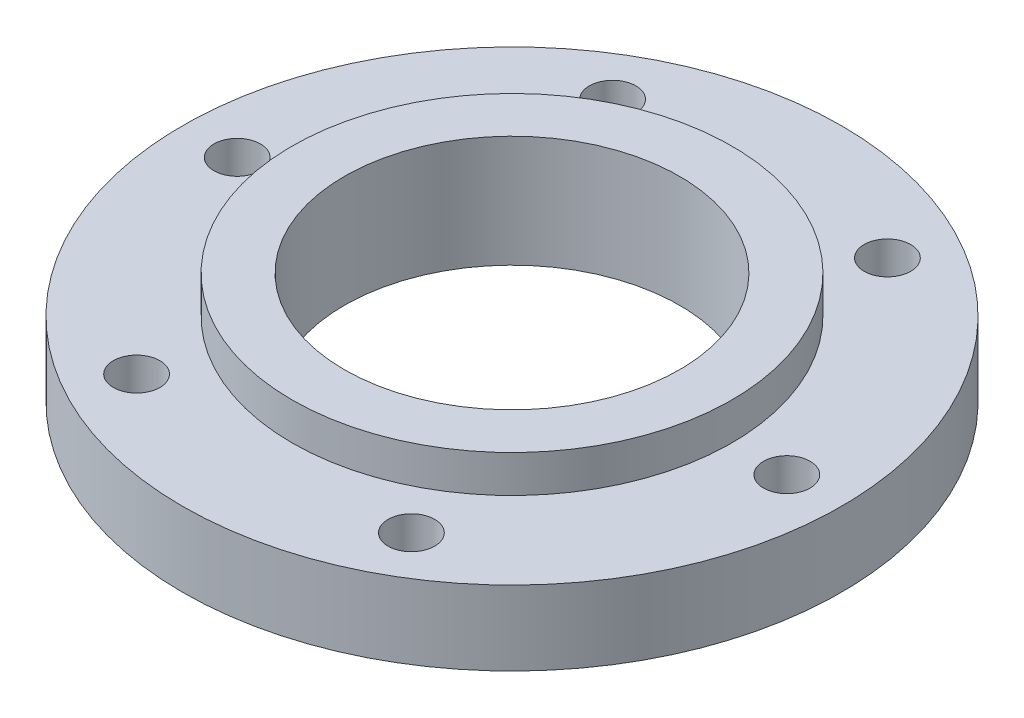
ISO-10303-21;
HEADER;
FILE_DESCRIPTION(('STEP AP214'),'2;1');
FILE_NAME('part.step','',(''),(''),'','','');
FILE_SCHEMA(('AUTOMOTIVE_DESIGN { 1 0 10303 214 1 1 1 1 }'));
ENDSEC;
DATA;
#1=APPLICATION_CONTEXT('core data for automotive mechanical design processes');
#2=APPLICATION_PROTOCOL_DEFINITION('international standard','automotive_design',2000,#1);
#3=PRODUCT_CONTEXT('',#1,'mechanical');
#4=PRODUCT('Part','Part','',(#3));
#5=PRODUCT_RELATED_PRODUCT_CATEGORY('part','',(#4));
#6=PRODUCT_DEFINITION_FORMATION('','',#4);
#7=PRODUCT_DEFINITION_CONTEXT('part definition',#1,'design');
#8=PRODUCT_DEFINITION('design','',#6,#7);
#9=PRODUCT_DEFINITION_SHAPE('','',#8);
#10=(LENGTH_UNIT() NAMED_UNIT(*) SI_UNIT(.MILLI.,.METRE.));
#11=(NAMED_UNIT(*) PLANE_ANGLE_UNIT() SI_UNIT($,.RADIAN.));
#12=(NAMED_UNIT(*) SI_UNIT($,.STERADIAN.) SOLID_ANGLE_UNIT());
#13=UNCERTAINTY_MEASURE_WITH_UNIT(LENGTH_MEASURE(1.E-05),#10,'distance_accuracy_value','');
#14=(GEOMETRIC_REPRESENTATION_CONTEXT(3) GLOBAL_UNCERTAINTY_ASSIGNED_CONTEXT((#13)) GLOBAL_UNIT_ASSIGNED_CONTEXT((#10,
#11,#12)) REPRESENTATION_CONTEXT('',''));
#15=CARTESIAN_POINT('',(0.,0.,0.));
#16=DIRECTION('',(0.,0.,1.));
#17=DIRECTION('',(1.,0.,0.));
#18=AXIS2_PLACEMENT_3D('',#15,#16,#17);
#19=CARTESIAN_POINT('',(0.,5.08,0.));
#20=DIRECTION('',(0.,1.,0.));
#21=DIRECTION('',(0.,0.,1.));
#22=AXIS2_PLACEMENT_3D('',#19,#20,#21);
#23=PLANE('',#22);
#24=CARTESIAN_POINT('',(-18.7454233572628,5.08,0.));
#25=DIRECTION('',(0.,1.,0.));
#26=DIRECTION('',(0.,0.,1.));
#27=AXIS2_PLACEMENT_3D('',#24,#25,#26);
#28=CIRCLE('',#27,1.5875);
#29=CARTESIAN_POINT('',(-18.7454233572628,5.08,1.5875));
#30=VERTEX_POINT('',#29);
#31=EDGE_CURVE('E83',#30,#30,#28,.T.);
#32=ORIENTED_EDGE('',*,*,#31,.F.);
#33=EDGE_LOOP('',(#32));
#34=FACE_BOUND('',#33,.T.);
#35=CARTESIAN_POINT('',(-9.3727116786316,5.08,16.2340128320837));
#36=DIRECTION('',(0.,1.,0.));
#37=DIRECTION('',(0.,0.,1.));
#38=AXIS2_PLACEMENT_3D('',#35,#36,#37);
#39=CIRCLE('',#38,1.5875);
#40=CARTESIAN_POINT('',(-9.3727116786316,5.08,17.8215128320837));
#41=VERTEX_POINT('',#40);
#42=EDGE_CURVE('E84',#41,#41,#39,.T.);
#43=ORIENTED_EDGE('',*,*,#42,.F.);
#44=EDGE_LOOP('',(#43));
#45=FACE_BOUND('',#44,.T.);
#46=CARTESIAN_POINT('',(9.37271167863126,5.08,16.2340128320839));
#47=DIRECTION('',(0.,1.,0.));
#48=DIRECTION('',(0.,0.,1.));
#49=AXIS2_PLACEMENT_3D('',#46,#47,#48);
#50=CIRCLE('',#49,1.5875);
#51=CARTESIAN_POINT('',(9.37271167863126,5.08,17.8215128320839));
#52=VERTEX_POINT('',#51);
#53=EDGE_CURVE('E58',#52,#52,#50,.T.);
#54=ORIENTED_EDGE('',*,*,#53,.F.);
#55=EDGE_LOOP('',(#54));
#56=FACE_BOUND('',#55,.T.);
#57=CARTESIAN_POINT('',(18.7454233572628,5.08,1.30898591681195E-13));
#58=DIRECTION('',(0.,1.,0.));
#59=DIRECTION('',(0.,0.,1.));
#60=AXIS2_PLACEMENT_3D('',#57,#58,#59);
#61=CIRCLE('',#60,1.5875);
#62=CARTESIAN_POINT('',(18.7454233572628,5.08,1.58750000000013));
#63=VERTEX_POINT('',#62);
#64=EDGE_CURVE('E65',#63,#63,#61,.T.);
#65=ORIENTED_EDGE('',*,*,#64,.F.);
#66=EDGE_LOOP('',(#65));
#67=FACE_BOUND('',#66,.T.);
#68=CARTESIAN_POINT('',(9.37271167863149,5.08,-16.2340128320837));
#69=DIRECTION('',(0.,1.,0.));
#70=DIRECTION('',(0.,0.,1.));
#71=AXIS2_PLACEMENT_3D('',#68,#69,#70);
#72=CIRCLE('',#71,1.5875);
#73=CARTESIAN_POINT('',(9.37271167863149,5.08,-14.6465128320837));
#74=VERTEX_POINT('',#73);
#75=EDGE_CURVE('E71',#74,#74,#72,.T.);
#76=ORIENTED_EDGE('',*,*,#75,.F.);
#77=EDGE_LOOP('',(#76));
#78=FACE_BOUND('',#77,.T.);
#79=CARTESIAN_POINT('',(-9.37271167863138,5.08,-16.2340128320838));
#80=DIRECTION('',(0.,1.,0.));
#81=DIRECTION('',(0.,0.,1.));
#82=AXIS2_PLACEMENT_3D('',#79,#80,#81);
#83=CIRCLE('',#82,1.5875);
#84=CARTESIAN_POINT('',(-9.37271167863138,5.08,-14.6465128320838));
#85=VERTEX_POINT('',#84);
#86=EDGE_CURVE('E77',#85,#85,#83,.T.);
#87=ORIENTED_EDGE('',*,*,#86,.F.);
#88=EDGE_LOOP('',(#87));
#89=FACE_BOUND('',#88,.T.);
#90=CARTESIAN_POINT('',(0.,5.08,0.));
#91=DIRECTION('',(0.,1.,0.));
#92=DIRECTION('',(0.,0.,1.));
#93=AXIS2_PLACEMENT_3D('',#90,#91,#92);
#94=CIRCLE('',#93,22.479);
#95=CARTESIAN_POINT('',(0.,5.08,22.479));
#96=VERTEX_POINT('',#95);
#97=EDGE_CURVE('E10',#96,#96,#94,.T.);
#98=ORIENTED_EDGE('',*,*,#97,.T.);
#99=EDGE_LOOP('',(#98));
#100=FACE_BOUND('',#99,.T.);
#101=CARTESIAN_POINT('',(0.,5.08,0.));
#102=DIRECTION('',(0.,1.,0.));
#103=DIRECTION('',(0.,0.,1.));
#104=AXIS2_PLACEMENT_3D('',#101,#102,#103);
#105=CIRCLE('',#104,14.9987);
#106=CARTESIAN_POINT('',(0.,5.08,14.9987));
#107=VERTEX_POINT('',#106);
#108=EDGE_CURVE('E49',#107,#107,#105,.T.);
#109=ORIENTED_EDGE('',*,*,#108,.F.);
#110=EDGE_LOOP('',(#109));
#111=FACE_BOUND('',#110,.T.);
#112=ADVANCED_FACE('F33',(#34,#45,#56,#67,#78,#89,#100,#111),#23,.T.);
#113=CARTESIAN_POINT('',(0.,0.,0.));
#114=DIRECTION('',(0.,1.,0.));
#115=DIRECTION('',(0.,0.,1.));
#116=AXIS2_PLACEMENT_3D('',#113,#114,#115);
#117=PLANE('',#116);
#118=CARTESIAN_POINT('',(-18.7454233572628,0.,0.));
#119=DIRECTION('',(0.,1.,0.));
#120=DIRECTION('',(0.,0.,1.));
#121=AXIS2_PLACEMENT_3D('',#118,#119,#120);
#122=CIRCLE('',#121,1.5875);
#123=CARTESIAN_POINT('',(-18.7454233572628,0.,1.5875));
#124=VERTEX_POINT('',#123);
#125=EDGE_CURVE('E57',#124,#124,#122,.T.);
#126=ORIENTED_EDGE('',*,*,#125,.T.);
#127=EDGE_LOOP('',(#126));
#128=FACE_BOUND('',#127,.T.);
#129=CARTESIAN_POINT('',(-9.3727116786316,0.,16.2340128320837));
#130=DIRECTION('',(0.,1.,0.));
#131=DIRECTION('',(0.,0.,1.));
#132=AXIS2_PLACEMENT_3D('',#129,#130,#131);
#133=CIRCLE('',#132,1.5875);
#134=CARTESIAN_POINT('',(-9.3727116786316,0.,17.8215128320837));
#135=VERTEX_POINT('',#134);
#136=EDGE_CURVE('E62',#135,#135,#133,.T.);
#137=ORIENTED_EDGE('',*,*,#136,.T.);
#138=EDGE_LOOP('',(#137));
#139=FACE_BOUND('',#138,.T.);
#140=CARTESIAN_POINT('',(9.37271167863126,0.,16.2340128320839));
#141=DIRECTION('',(0.,1.,0.));
#142=DIRECTION('',(0.,0.,1.));
#143=AXIS2_PLACEMENT_3D('',#140,#141,#142);
#144=CIRCLE('',#143,1.5875);
#145=CARTESIAN_POINT('',(9.37271167863126,0.,17.8215128320839));
#146=VERTEX_POINT('',#145);
#147=EDGE_CURVE('E61',#146,#146,#144,.T.);
#148=ORIENTED_EDGE('',*,*,#147,.T.);
#149=EDGE_LOOP('',(#148));
#150=FACE_BOUND('',#149,.T.);
#151=CARTESIAN_POINT('',(18.7454233572628,0.,1.30898591681195E-13));
#152=DIRECTION('',(0.,1.,0.));
#153=DIRECTION('',(0.,0.,1.));
#154=AXIS2_PLACEMENT_3D('',#151,#152,#153);
#155=CIRCLE('',#154,1.5875);
#156=CARTESIAN_POINT('',(18.7454233572628,0.,1.58750000000013));
#157=VERTEX_POINT('',#156);
#158=EDGE_CURVE('E68',#157,#157,#155,.T.);
#159=ORIENTED_EDGE('',*,*,#158,.T.);
#160=EDGE_LOOP('',(#159));
#161=FACE_BOUND('',#160,.T.);
#162=CARTESIAN_POINT('',(9.37271167863149,0.,-16.2340128320837));
#163=DIRECTION('',(0.,1.,0.));
#164=DIRECTION('',(0.,0.,1.));
#165=AXIS2_PLACEMENT_3D('',#162,#163,#164);
#166=CIRCLE('',#165,1.5875);
#167=CARTESIAN_POINT('',(9.37271167863149,0.,-14.6465128320837));
#168=VERTEX_POINT('',#167);
#169=EDGE_CURVE('E74',#168,#168,#166,.T.);
#170=ORIENTED_EDGE('',*,*,#169,.T.);
#171=EDGE_LOOP('',(#170));
#172=FACE_BOUND('',#171,.T.);
#173=CARTESIAN_POINT('',(-9.37271167863138,0.,-16.2340128320838));
#174=DIRECTION('',(0.,1.,0.));
#175=DIRECTION('',(0.,0.,1.));
#176=AXIS2_PLACEMENT_3D('',#173,#174,#175);
#177=CIRCLE('',#176,1.5875);
#178=CARTESIAN_POINT('',(-9.37271167863138,0.,-14.6465128320838));
#179=VERTEX_POINT('',#178);
#180=EDGE_CURVE('E80',#179,#179,#177,.T.);
#181=ORIENTED_EDGE('',*,*,#180,.T.);
#182=EDGE_LOOP('',(#181));
#183=FACE_BOUND('',#182,.T.);
#184=CARTESIAN_POINT('',(0.,0.,0.));
#185=DIRECTION('',(0.,1.,0.));
#186=DIRECTION('',(0.,0.,1.));
#187=AXIS2_PLACEMENT_3D('',#184,#185,#186);
#188=CIRCLE('',#187,22.479);
#189=CARTESIAN_POINT('',(0.,0.,22.479));
#190=VERTEX_POINT('',#189);
#191=EDGE_CURVE('E37',#190,#190,#188,.T.);
#192=ORIENTED_EDGE('',*,*,#191,.F.);
#193=EDGE_LOOP('',(#192));
#194=FACE_BOUND('',#193,.T.);
#195=CARTESIAN_POINT('',(0.,0.,0.));
#196=DIRECTION('',(0.,1.,0.));
#197=DIRECTION('',(0.,0.,1.));
#198=AXIS2_PLACEMENT_3D('',#195,#196,#197);
#199=CIRCLE('',#198,11.43);
#200=CARTESIAN_POINT('',(0.,0.,11.43));
#201=VERTEX_POINT('',#200);
#202=EDGE_CURVE('E44',#201,#201,#199,.T.);
#203=ORIENTED_EDGE('',*,*,#202,.T.);
#204=EDGE_LOOP('',(#203));
#205=FACE_BOUND('',#204,.T.);
#206=ADVANCED_FACE('F94',(#128,#139,#150,#161,#172,#183,#194,#205),#117,.F.);
#207=CARTESIAN_POINT('',(0.,5.08,0.));
#208=DIRECTION('',(0.,-1.,0.));
#209=DIRECTION('',(0.,0.,-1.));
#210=AXIS2_PLACEMENT_3D('',#207,#208,#209);
#211=CYLINDRICAL_SURFACE('',#210,22.479);
#212=ORIENTED_EDGE('',*,*,#97,.F.);
#213=EDGE_LOOP('',(#212));
#214=FACE_BOUND('',#213,.T.);
#215=ORIENTED_EDGE('',*,*,#191,.T.);
#216=EDGE_LOOP('',(#215));
#217=FACE_BOUND('',#216,.T.);
#218=ADVANCED_FACE('F35',(#214,#217),#211,.T.);
#219=CARTESIAN_POINT('',(0.,5.08,0.));
#220=DIRECTION('',(0.,-1.,0.));
#221=DIRECTION('',(0.,0.,-1.));
#222=AXIS2_PLACEMENT_3D('',#219,#220,#221);
#223=CYLINDRICAL_SURFACE('',#222,11.43);
#224=ORIENTED_EDGE('',*,*,#202,.F.);
#225=EDGE_LOOP('',(#224));
#226=FACE_BOUND('',#225,.T.);
#227=CARTESIAN_POINT('',(0.,7.62,0.));
#228=DIRECTION('',(0.,1.,0.));
#229=DIRECTION('',(0.,0.,1.));
#230=AXIS2_PLACEMENT_3D('',#227,#228,#229);
#231=CIRCLE('',#230,11.43);
#232=CARTESIAN_POINT('',(0.,7.62,11.43));
#233=VERTEX_POINT('',#232);
#234=EDGE_CURVE('E52',#233,#233,#231,.T.);
#235=ORIENTED_EDGE('',*,*,#234,.T.);
#236=EDGE_LOOP('',(#235));
#237=FACE_BOUND('',#236,.T.);
#238=ADVANCED_FACE('F132',(#226,#237),#223,.F.);
#239=CARTESIAN_POINT('',(0.,7.62,0.));
#240=DIRECTION('',(0.,1.,0.));
#241=DIRECTION('',(0.,0.,1.));
#242=AXIS2_PLACEMENT_3D('',#239,#240,#241);
#243=PLANE('',#242);
#244=CARTESIAN_POINT('',(0.,7.62,0.));
#245=DIRECTION('',(0.,1.,0.));
#246=DIRECTION('',(0.,0.,1.));
#247=AXIS2_PLACEMENT_3D('',#244,#245,#246);
#248=CIRCLE('',#247,14.9987);
#249=CARTESIAN_POINT('',(0.,7.62,14.9987));
#250=VERTEX_POINT('',#249);
#251=EDGE_CURVE('E48',#250,#250,#248,.T.);
#252=ORIENTED_EDGE('',*,*,#251,.T.);
#253=EDGE_LOOP('',(#252));
#254=FACE_BOUND('',#253,.T.);
#255=ORIENTED_EDGE('',*,*,#234,.F.);
#256=EDGE_LOOP('',(#255));
#257=FACE_BOUND('',#256,.T.);
#258=ADVANCED_FACE('F122',(#254,#257),#243,.T.);
#259=CARTESIAN_POINT('',(0.,7.62,0.));
#260=DIRECTION('',(0.,-1.,0.));
#261=DIRECTION('',(0.,0.,-1.));
#262=AXIS2_PLACEMENT_3D('',#259,#260,#261);
#263=CYLINDRICAL_SURFACE('',#262,14.9987);
#264=ORIENTED_EDGE('',*,*,#251,.F.);
#265=EDGE_LOOP('',(#264));
#266=FACE_BOUND('',#265,.T.);
#267=ORIENTED_EDGE('',*,*,#108,.T.);
#268=EDGE_LOOP('',(#267));
#269=FACE_BOUND('',#268,.T.);
#270=ADVANCED_FACE('F119',(#266,#269),#263,.T.);
#271=CARTESIAN_POINT('',(-9.37271167863138,0.,-16.2340128320838));
#272=DIRECTION('',(0.,1.,0.));
#273=DIRECTION('',(0.,0.,1.));
#274=AXIS2_PLACEMENT_3D('',#271,#272,#273);
#275=CYLINDRICAL_SURFACE('',#274,1.5875);
#276=ORIENTED_EDGE('',*,*,#180,.F.);
#277=EDGE_LOOP('',(#276));
#278=FACE_BOUND('',#277,.T.);
#279=ORIENTED_EDGE('',*,*,#86,.T.);
#280=EDGE_LOOP('',(#279));
#281=FACE_BOUND('',#280,.T.);
#282=ADVANCED_FACE('F121',(#278,#281),#275,.F.);
#283=CARTESIAN_POINT('',(9.37271167863149,0.,-16.2340128320837));
#284=DIRECTION('',(0.,1.,0.));
#285=DIRECTION('',(0.,0.,1.));
#286=AXIS2_PLACEMENT_3D('',#283,#284,#285);
#287=CYLINDRICAL_SURFACE('',#286,1.5875);
#288=ORIENTED_EDGE('',*,*,#169,.F.);
#289=EDGE_LOOP('',(#288));
#290=FACE_BOUND('',#289,.T.);
#291=ORIENTED_EDGE('',*,*,#75,.T.);
#292=EDGE_LOOP('',(#291));
#293=FACE_BOUND('',#292,.T.);
#294=ADVANCED_FACE('F129',(#290,#293),#287,.F.);
#295=CARTESIAN_POINT('',(18.7454233572628,0.,1.30898591681195E-13));
#296=DIRECTION('',(0.,1.,0.));
#297=DIRECTION('',(0.,0.,1.));
#298=AXIS2_PLACEMENT_3D('',#295,#296,#297);
#299=CYLINDRICAL_SURFACE('',#298,1.5875);
#300=ORIENTED_EDGE('',*,*,#158,.F.);
#301=EDGE_LOOP('',(#300));
#302=FACE_BOUND('',#301,.T.);
#303=ORIENTED_EDGE('',*,*,#64,.T.);
#304=EDGE_LOOP('',(#303));
#305=FACE_BOUND('',#304,.T.);
#306=ADVANCED_FACE('F193',(#302,#305),#299,.F.);
#307=CARTESIAN_POINT('',(9.37271167863126,0.,16.2340128320839));
#308=DIRECTION('',(0.,1.,0.));
#309=DIRECTION('',(0.,0.,1.));
#310=AXIS2_PLACEMENT_3D('',#307,#308,#309);
#311=CYLINDRICAL_SURFACE('',#310,1.5875);
#312=ORIENTED_EDGE('',*,*,#147,.F.);
#313=EDGE_LOOP('',(#312));
#314=FACE_BOUND('',#313,.T.);
#315=ORIENTED_EDGE('',*,*,#53,.T.);
#316=EDGE_LOOP('',(#315));
#317=FACE_BOUND('',#316,.T.);
#318=ADVANCED_FACE('F203',(#314,#317),#311,.F.);
#319=CARTESIAN_POINT('',(-9.3727116786316,0.,16.2340128320837));
#320=DIRECTION('',(0.,1.,0.));
#321=DIRECTION('',(0.,0.,1.));
#322=AXIS2_PLACEMENT_3D('',#319,#320,#321);
#323=CYLINDRICAL_SURFACE('',#322,1.5875);
#324=ORIENTED_EDGE('',*,*,#136,.F.);
#325=EDGE_LOOP('',(#324));
#326=FACE_BOUND('',#325,.T.);
#327=ORIENTED_EDGE('',*,*,#42,.T.);
#328=EDGE_LOOP('',(#327));
#329=FACE_BOUND('',#328,.T.);
#330=ADVANCED_FACE('F100',(#326,#329),#323,.F.);
#331=CARTESIAN_POINT('',(-18.7454233572628,0.,0.));
#332=DIRECTION('',(0.,1.,0.));
#333=DIRECTION('',(0.,0.,1.));
#334=AXIS2_PLACEMENT_3D('',#331,#332,#333);
#335=CYLINDRICAL_SURFACE('',#334,1.5875);
#336=ORIENTED_EDGE('',*,*,#125,.F.);
#337=EDGE_LOOP('',(#336));
#338=FACE_BOUND('',#337,.T.);
#339=ORIENTED_EDGE('',*,*,#31,.T.);
#340=EDGE_LOOP('',(#339));
#341=FACE_BOUND('',#340,.T.);
#342=ADVANCED_FACE('F97',(#338,#341),#335,.F.);
#343=CLOSED_SHELL('',(#112,#206,#218,#238,#258,#270,#282,#294,#306,#318,#330,#342));
#344=MANIFOLD_SOLID_BREP('B2',#343);
#345=ADVANCED_BREP_SHAPE_REPRESENTATION('',(#18,#344),#14);
#346=SHAPE_DEFINITION_REPRESENTATION(#9,#345);
ENDSEC;
END-ISO-10303-21;
